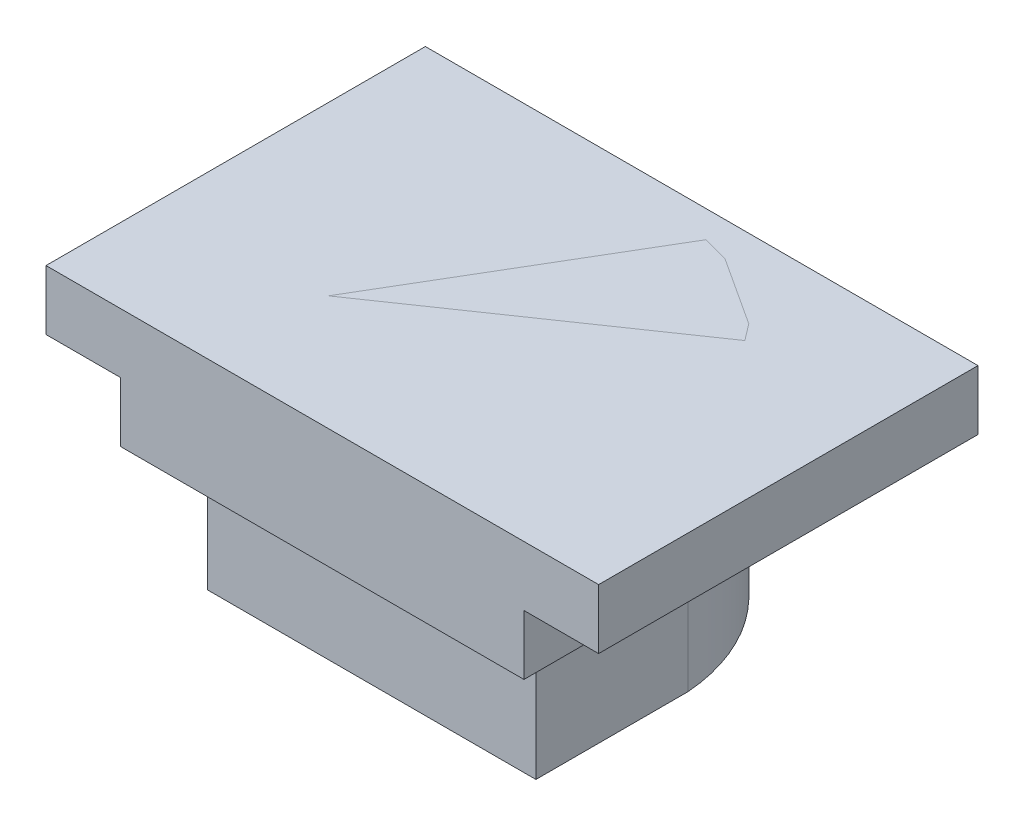
ISO-10303-21;
HEADER;
FILE_DESCRIPTION(('STEP AP214'),'2;1');
FILE_NAME('part.step','',(''),(''),'','','');
FILE_SCHEMA(('AUTOMOTIVE_DESIGN { 1 0 10303 214 1 1 1 1 }'));
ENDSEC;
DATA;
#1=APPLICATION_CONTEXT('core data for automotive mechanical design processes');
#2=APPLICATION_PROTOCOL_DEFINITION('international standard','automotive_design',2000,#1);
#3=PRODUCT_CONTEXT('',#1,'mechanical');
#4=PRODUCT('Part','Part','',(#3));
#5=PRODUCT_RELATED_PRODUCT_CATEGORY('part','',(#4));
#6=PRODUCT_DEFINITION_FORMATION('','',#4);
#7=PRODUCT_DEFINITION_CONTEXT('part definition',#1,'design');
#8=PRODUCT_DEFINITION('design','',#6,#7);
#9=PRODUCT_DEFINITION_SHAPE('','',#8);
#10=(LENGTH_UNIT() NAMED_UNIT(*) SI_UNIT(.MILLI.,.METRE.));
#11=(NAMED_UNIT(*) PLANE_ANGLE_UNIT() SI_UNIT($,.RADIAN.));
#12=(NAMED_UNIT(*) SI_UNIT($,.STERADIAN.) SOLID_ANGLE_UNIT());
#13=UNCERTAINTY_MEASURE_WITH_UNIT(LENGTH_MEASURE(1.E-05),#10,'distance_accuracy_value','');
#14=(GEOMETRIC_REPRESENTATION_CONTEXT(3) GLOBAL_UNCERTAINTY_ASSIGNED_CONTEXT((#13)) GLOBAL_UNIT_ASSIGNED_CONTEXT((#10,
#11,#12)) REPRESENTATION_CONTEXT('',''));
#15=CARTESIAN_POINT('',(0.,0.,0.));
#16=DIRECTION('',(0.,0.,1.));
#17=DIRECTION('',(1.,0.,0.));
#18=AXIS2_PLACEMENT_3D('',#15,#16,#17);
#19=CARTESIAN_POINT('',(-3.0812919081969,-14.6034531628728,-2.56662941493609));
#20=DIRECTION('',(0.,1.,0.));
#21=DIRECTION('',(0.,0.,1.));
#22=AXIS2_PLACEMENT_3D('',#19,#20,#21);
#23=CYLINDRICAL_SURFACE('',#22,2.99041189);
#24=DIRECTION('',(0.,1.,0.));
#25=VECTOR('',#24,1.);
#26=CARTESIAN_POINT('',(-2.5,-14.6034531628728,-5.5));
#27=LINE('',#26,#25);
#28=CARTESIAN_POINT('',(-2.5,-5.,-5.5));
#29=VERTEX_POINT('',#28);
#30=CARTESIAN_POINT('',(-2.5,-1.,-5.5));
#31=VERTEX_POINT('',#30);
#32=EDGE_CURVE('E76',#29,#31,#27,.T.);
#33=ORIENTED_EDGE('',*,*,#32,.T.);
#34=CARTESIAN_POINT('',(-3.0812919081969,-0.999999999999999,-2.56662941493609));
#35=DIRECTION('',(0.,-1.,0.));
#36=DIRECTION('',(0.,0.,-1.));
#37=AXIS2_PLACEMENT_3D('',#34,#35,#36);
#38=CIRCLE('',#37,2.99041189);
#39=CARTESIAN_POINT('',(-0.1,-0.999999999999999,-2.8));
#40=VERTEX_POINT('',#39);
#41=EDGE_CURVE('E70',#31,#40,#38,.T.);
#42=ORIENTED_EDGE('',*,*,#41,.T.);
#43=DIRECTION('',(0.,1.,0.));
#44=VECTOR('',#43,1.);
#45=CARTESIAN_POINT('',(-0.1,-14.6034531628728,-2.8));
#46=LINE('',#45,#44);
#47=CARTESIAN_POINT('',(-0.1,-5.,-2.8));
#48=VERTEX_POINT('',#47);
#49=EDGE_CURVE('E130',#48,#40,#46,.T.);
#50=ORIENTED_EDGE('',*,*,#49,.F.);
#51=CARTESIAN_POINT('',(-3.0812919081969,-5.,-2.56662941493609));
#52=DIRECTION('',(0.,-1.,0.));
#53=DIRECTION('',(0.,0.,-1.));
#54=AXIS2_PLACEMENT_3D('',#51,#52,#53);
#55=CIRCLE('',#54,2.99041189);
#56=EDGE_CURVE('E63',#29,#48,#55,.T.);
#57=ORIENTED_EDGE('',*,*,#56,.F.);
#58=EDGE_LOOP('',(#33,#42,#50,#57));
#59=FACE_BOUND('',#58,.T.);
#60=ADVANCED_FACE('F54',(#59),#23,.T.);
#61=CARTESIAN_POINT('',(-0.1,-14.6034531628728,0.));
#62=DIRECTION('',(1.,0.,0.));
#63=DIRECTION('',(0.,0.,-1.));
#64=AXIS2_PLACEMENT_3D('',#61,#62,#63);
#65=PLANE('',#64);
#66=DIRECTION('',(0.,0.,-1.));
#67=VECTOR('',#66,1.);
#68=CARTESIAN_POINT('',(-0.1,-0.999999999999999,0.));
#69=LINE('',#68,#67);
#70=CARTESIAN_POINT('',(-0.1,-0.999999999999999,-0.249999999999999));
#71=VERTEX_POINT('',#70);
#72=EDGE_CURVE('E132',#71,#40,#69,.T.);
#73=ORIENTED_EDGE('',*,*,#72,.F.);
#74=DIRECTION('',(0.,1.,0.));
#75=VECTOR('',#74,1.);
#76=CARTESIAN_POINT('',(-0.1,-14.6034531628728,-0.249999999999999));
#77=LINE('',#76,#75);
#78=CARTESIAN_POINT('',(-0.1,-5.,-0.249999999999999));
#79=VERTEX_POINT('',#78);
#80=EDGE_CURVE('E142',#79,#71,#77,.T.);
#81=ORIENTED_EDGE('',*,*,#80,.F.);
#82=DIRECTION('',(0.,0.,-1.));
#83=VECTOR('',#82,1.);
#84=CARTESIAN_POINT('',(-0.1,-5.,0.));
#85=LINE('',#84,#83);
#86=EDGE_CURVE('E126',#79,#48,#85,.T.);
#87=ORIENTED_EDGE('',*,*,#86,.T.);
#88=ORIENTED_EDGE('',*,*,#49,.T.);
#89=EDGE_LOOP('',(#73,#81,#87,#88));
#90=FACE_BOUND('',#89,.T.);
#91=ADVANCED_FACE('F159',(#90),#65,.T.);
#92=CARTESIAN_POINT('',(0.,-14.6034531628728,-0.249999999999999));
#93=DIRECTION('',(0.,0.,1.));
#94=DIRECTION('',(1.,0.,0.));
#95=AXIS2_PLACEMENT_3D('',#92,#93,#94);
#96=PLANE('',#95);
#97=DIRECTION('',(1.,0.,0.));
#98=VECTOR('',#97,1.);
#99=CARTESIAN_POINT('',(0.,-0.999999999999999,-0.249999999999999));
#100=LINE('',#99,#98);
#101=CARTESIAN_POINT('',(-5.6,-0.999999999999999,-0.249999999999999));
#102=VERTEX_POINT('',#101);
#103=EDGE_CURVE('E111',#102,#71,#100,.T.);
#104=ORIENTED_EDGE('',*,*,#103,.F.);
#105=DIRECTION('',(0.,1.,0.));
#106=VECTOR('',#105,1.);
#107=CARTESIAN_POINT('',(-5.6,-14.6034531628728,-0.249999999999999));
#108=LINE('',#107,#106);
#109=CARTESIAN_POINT('',(-5.6,-5.,-0.249999999999999));
#110=VERTEX_POINT('',#109);
#111=EDGE_CURVE('E109',#110,#102,#108,.T.);
#112=ORIENTED_EDGE('',*,*,#111,.F.);
#113=DIRECTION('',(1.,0.,0.));
#114=VECTOR('',#113,1.);
#115=CARTESIAN_POINT('',(0.,-5.,-0.249999999999999));
#116=LINE('',#115,#114);
#117=EDGE_CURVE('E143',#110,#79,#116,.T.);
#118=ORIENTED_EDGE('',*,*,#117,.T.);
#119=ORIENTED_EDGE('',*,*,#80,.T.);
#120=EDGE_LOOP('',(#104,#112,#118,#119));
#121=FACE_BOUND('',#120,.T.);
#122=ADVANCED_FACE('F154',(#121),#96,.T.);
#123=CARTESIAN_POINT('',(-5.6,-14.6034531628728,0.));
#124=DIRECTION('',(-1.,0.,0.));
#125=DIRECTION('',(0.,0.,1.));
#126=AXIS2_PLACEMENT_3D('',#123,#124,#125);
#127=PLANE('',#126);
#128=DIRECTION('',(0.,0.,1.));
#129=VECTOR('',#128,1.);
#130=CARTESIAN_POINT('',(-5.6,-0.999999999999999,0.));
#131=LINE('',#130,#129);
#132=CARTESIAN_POINT('',(-5.6,-0.999999999999999,-5.5));
#133=VERTEX_POINT('',#132);
#134=EDGE_CURVE('E101',#133,#102,#131,.T.);
#135=ORIENTED_EDGE('',*,*,#134,.F.);
#136=DIRECTION('',(0.,1.,0.));
#137=VECTOR('',#136,1.);
#138=CARTESIAN_POINT('',(-5.6,-14.6034531628728,-5.5));
#139=LINE('',#138,#137);
#140=CARTESIAN_POINT('',(-5.6,-5.,-5.5));
#141=VERTEX_POINT('',#140);
#142=EDGE_CURVE('E107',#141,#133,#139,.T.);
#143=ORIENTED_EDGE('',*,*,#142,.F.);
#144=DIRECTION('',(0.,0.,1.));
#145=VECTOR('',#144,1.);
#146=CARTESIAN_POINT('',(-5.6,-5.,0.));
#147=LINE('',#146,#145);
#148=EDGE_CURVE('E122',#141,#110,#147,.T.);
#149=ORIENTED_EDGE('',*,*,#148,.T.);
#150=ORIENTED_EDGE('',*,*,#111,.T.);
#151=EDGE_LOOP('',(#135,#143,#149,#150));
#152=FACE_BOUND('',#151,.T.);
#153=ADVANCED_FACE('F106',(#152),#127,.T.);
#154=CARTESIAN_POINT('',(0.,-14.6034531628728,-5.5));
#155=DIRECTION('',(0.,0.,1.));
#156=DIRECTION('',(1.,0.,0.));
#157=AXIS2_PLACEMENT_3D('',#154,#155,#156);
#158=PLANE('',#157);
#159=ORIENTED_EDGE('',*,*,#142,.T.);
#160=DIRECTION('',(1.,0.,0.));
#161=VECTOR('',#160,1.);
#162=CARTESIAN_POINT('',(0.,-0.999999999999999,-5.5));
#163=LINE('',#162,#161);
#164=EDGE_CURVE('E12',#133,#31,#163,.T.);
#165=ORIENTED_EDGE('',*,*,#164,.T.);
#166=ORIENTED_EDGE('',*,*,#32,.F.);
#167=DIRECTION('',(1.,0.,0.));
#168=VECTOR('',#167,1.);
#169=CARTESIAN_POINT('',(0.,-5.,-5.5));
#170=LINE('',#169,#168);
#171=EDGE_CURVE('E115',#141,#29,#170,.T.);
#172=ORIENTED_EDGE('',*,*,#171,.F.);
#173=EDGE_LOOP('',(#159,#165,#166,#172));
#174=FACE_BOUND('',#173,.T.);
#175=ADVANCED_FACE('F113',(#174),#158,.F.);
#176=CARTESIAN_POINT('',(-3.01188081954191,-5.,-2.61735800729014));
#177=DIRECTION('',(0.,-1.,0.));
#178=DIRECTION('',(0.,0.,-1.));
#179=AXIS2_PLACEMENT_3D('',#176,#177,#178);
#180=PLANE('',#179);
#181=ORIENTED_EDGE('',*,*,#171,.T.);
#182=ORIENTED_EDGE('',*,*,#56,.T.);
#183=ORIENTED_EDGE('',*,*,#86,.F.);
#184=ORIENTED_EDGE('',*,*,#117,.F.);
#185=ORIENTED_EDGE('',*,*,#148,.F.);
#186=EDGE_LOOP('',(#181,#182,#183,#184,#185));
#187=FACE_BOUND('',#186,.T.);
#188=ADVANCED_FACE('F56',(#187),#180,.T.);
#189=CARTESIAN_POINT('',(-3.01188081954191,-1.,-2.61735800729014));
#190=DIRECTION('',(0.,-1.,0.));
#191=DIRECTION('',(0.,0.,-1.));
#192=AXIS2_PLACEMENT_3D('',#189,#190,#191);
#193=PLANE('',#192);
#194=ORIENTED_EDGE('',*,*,#164,.F.);
#195=ORIENTED_EDGE('',*,*,#134,.T.);
#196=ORIENTED_EDGE('',*,*,#103,.T.);
#197=ORIENTED_EDGE('',*,*,#72,.T.);
#198=ORIENTED_EDGE('',*,*,#41,.F.);
#199=EDGE_LOOP('',(#194,#195,#196,#197,#198));
#200=FACE_BOUND('',#199,.T.);
#201=ADVANCED_FACE('F100',(#200),#193,.F.);
#202=CLOSED_SHELL('',(#60,#91,#122,#153,#175,#188,#201));
#203=MANIFOLD_SOLID_BREP('B2',#202);
#204=CARTESIAN_POINT('',(0.,-2.,0.));
#205=DIRECTION('',(0.,-1.,0.));
#206=DIRECTION('',(0.,0.,-1.));
#207=AXIS2_PLACEMENT_3D('',#204,#205,#206);
#208=PLANE('',#207);
#209=DIRECTION('',(1.,0.,0.));
#210=VECTOR('',#209,1.);
#211=CARTESIAN_POINT('',(-7.65,-2.,-5.95));
#212=LINE('',#211,#210);
#213=CARTESIAN_POINT('',(-7.65,-2.,-5.95));
#214=VERTEX_POINT('',#213);
#215=CARTESIAN_POINT('',(-6.4,-2.,-5.95));
#216=VERTEX_POINT('',#215);
#217=EDGE_CURVE('E335',#214,#216,#212,.T.);
#218=ORIENTED_EDGE('',*,*,#217,.T.);
#219=DIRECTION('',(0.,0.,1.));
#220=VECTOR('',#219,1.);
#221=CARTESIAN_POINT('',(-6.4,-2.,0.));
#222=LINE('',#221,#220);
#223=CARTESIAN_POINT('',(-6.4,-2.,0.4));
#224=VERTEX_POINT('',#223);
#225=EDGE_CURVE('E52',#216,#224,#222,.T.);
#226=ORIENTED_EDGE('',*,*,#225,.T.);
#227=DIRECTION('',(-1.,0.,0.));
#228=VECTOR('',#227,1.);
#229=CARTESIAN_POINT('',(-7.65,-2.,0.399999999999999));
#230=LINE('',#229,#228);
#231=CARTESIAN_POINT('',(-7.65,-2.,0.399999999999999));
#232=VERTEX_POINT('',#231);
#233=EDGE_CURVE('E339',#224,#232,#230,.T.);
#234=ORIENTED_EDGE('',*,*,#233,.T.);
#235=DIRECTION('',(0.,0.,-1.));
#236=VECTOR('',#235,1.);
#237=CARTESIAN_POINT('',(-7.65,-2.,0.399999999999999));
#238=LINE('',#237,#236);
#239=EDGE_CURVE('E330',#232,#214,#238,.T.);
#240=ORIENTED_EDGE('',*,*,#239,.T.);
#241=EDGE_LOOP('',(#218,#226,#234,#240));
#242=FACE_BOUND('',#241,.T.);
#243=ADVANCED_FACE('F220',(#242),#208,.T.);
#244=DIRECTION('',(0.,0.,-1.));
#245=VECTOR('',#244,1.);
#246=CARTESIAN_POINT('',(0.35,-2.,0.));
#247=LINE('',#246,#245);
#248=CARTESIAN_POINT('',(0.35,-2.,0.399999999999999));
#249=VERTEX_POINT('',#248);
#250=CARTESIAN_POINT('',(0.35,-2.,-2.75));
#251=VERTEX_POINT('',#250);
#252=EDGE_CURVE('E235',#249,#251,#247,.T.);
#253=ORIENTED_EDGE('',*,*,#252,.T.);
#254=CARTESIAN_POINT('',(-3.01188081954191,-2.,-2.61735800729014));
#255=DIRECTION('',(0.,-1.,0.));
#256=DIRECTION('',(0.,0.,-1.));
#257=AXIS2_PLACEMENT_3D('',#254,#255,#256);
#258=CIRCLE('',#257,3.36449647689425);
#259=CARTESIAN_POINT('',(-2.55,-2.,-5.95));
#260=VERTEX_POINT('',#259);
#261=EDGE_CURVE('E228',#251,#260,#258,.F.);
#262=ORIENTED_EDGE('',*,*,#261,.T.);
#263=CARTESIAN_POINT('',(1.6,-2.,-5.95));
#264=VERTEX_POINT('',#263);
#265=EDGE_CURVE('E333',#260,#264,#212,.T.);
#266=ORIENTED_EDGE('',*,*,#265,.T.);
#267=DIRECTION('',(0.,0.,1.));
#268=VECTOR('',#267,1.);
#269=CARTESIAN_POINT('',(1.6,-2.,0.399999999999999));
#270=LINE('',#269,#268);
#271=CARTESIAN_POINT('',(1.6,-2.,0.399999999999999));
#272=VERTEX_POINT('',#271);
#273=EDGE_CURVE('E337',#264,#272,#270,.T.);
#274=ORIENTED_EDGE('',*,*,#273,.T.);
#275=EDGE_CURVE('E240',#272,#249,#230,.T.);
#276=ORIENTED_EDGE('',*,*,#275,.T.);
#277=EDGE_LOOP('',(#253,#262,#266,#274,#276));
#278=FACE_BOUND('',#277,.T.);
#279=ADVANCED_FACE('F358',(#278),#208,.T.);
#280=CARTESIAN_POINT('',(-6.4,-1.,-5.95));
#281=DIRECTION('',(0.,0.,1.));
#282=DIRECTION('',(1.,0.,0.));
#283=AXIS2_PLACEMENT_3D('',#280,#281,#282);
#284=PLANE('',#283);
#285=DIRECTION('',(1.,0.,0.));
#286=VECTOR('',#285,1.);
#287=CARTESIAN_POINT('',(-7.65,-1.,-5.95));
#288=LINE('',#287,#286);
#289=CARTESIAN_POINT('',(-7.65,-1.,-5.95));
#290=VERTEX_POINT('',#289);
#291=CARTESIAN_POINT('',(1.6,-1.,-5.95));
#292=VERTEX_POINT('',#291);
#293=EDGE_CURVE('E315',#290,#292,#288,.T.);
#294=ORIENTED_EDGE('',*,*,#293,.T.);
#295=DIRECTION('',(0.,1.,0.));
#296=VECTOR('',#295,1.);
#297=CARTESIAN_POINT('',(1.6,-2.,-5.95));
#298=LINE('',#297,#296);
#299=EDGE_CURVE('E351',#264,#292,#298,.T.);
#300=ORIENTED_EDGE('',*,*,#299,.F.);
#301=ORIENTED_EDGE('',*,*,#265,.F.);
#302=DIRECTION('',(0.,1.,0.));
#303=VECTOR('',#302,1.);
#304=CARTESIAN_POINT('',(-2.55,-15.2674160368465,-5.95));
#305=LINE('',#304,#303);
#306=CARTESIAN_POINT('',(-2.55,-3.,-5.95));
#307=VERTEX_POINT('',#306);
#308=EDGE_CURVE('E325',#307,#260,#305,.T.);
#309=ORIENTED_EDGE('',*,*,#308,.F.);
#310=DIRECTION('',(1.,0.,0.));
#311=VECTOR('',#310,1.);
#312=CARTESIAN_POINT('',(-6.4,-3.,-5.95));
#313=LINE('',#312,#311);
#314=CARTESIAN_POINT('',(-6.4,-3.,-5.95));
#315=VERTEX_POINT('',#314);
#316=EDGE_CURVE('E317',#315,#307,#313,.T.);
#317=ORIENTED_EDGE('',*,*,#316,.F.);
#318=DIRECTION('',(0.,1.,0.));
#319=VECTOR('',#318,1.);
#320=CARTESIAN_POINT('',(-6.4,-15.2674160368465,-5.95));
#321=LINE('',#320,#319);
#322=EDGE_CURVE('E322',#315,#216,#321,.T.);
#323=ORIENTED_EDGE('',*,*,#322,.T.);
#324=ORIENTED_EDGE('',*,*,#217,.F.);
#325=DIRECTION('',(0.,1.,0.));
#326=VECTOR('',#325,1.);
#327=CARTESIAN_POINT('',(-7.65,-2.,-5.95));
#328=LINE('',#327,#326);
#329=EDGE_CURVE('E354',#214,#290,#328,.T.);
#330=ORIENTED_EDGE('',*,*,#329,.T.);
#331=EDGE_LOOP('',(#294,#300,#301,#309,#317,#323,#324,#330));
#332=FACE_BOUND('',#331,.T.);
#333=ADVANCED_FACE('F222',(#332),#284,.F.);
#334=CARTESIAN_POINT('',(-6.4,-1.,0.4));
#335=DIRECTION('',(0.,0.,-1.));
#336=DIRECTION('',(-1.,0.,0.));
#337=AXIS2_PLACEMENT_3D('',#334,#335,#336);
#338=PLANE('',#337);
#339=DIRECTION('',(-1.,0.,0.));
#340=VECTOR('',#339,1.);
#341=CARTESIAN_POINT('',(-7.65,-1.,0.399999999999999));
#342=LINE('',#341,#340);
#343=CARTESIAN_POINT('',(1.6,-1.,0.399999999999999));
#344=VERTEX_POINT('',#343);
#345=CARTESIAN_POINT('',(-7.65,-1.,0.399999999999999));
#346=VERTEX_POINT('',#345);
#347=EDGE_CURVE('E334',#344,#346,#342,.T.);
#348=ORIENTED_EDGE('',*,*,#347,.T.);
#349=DIRECTION('',(0.,1.,0.));
#350=VECTOR('',#349,1.);
#351=CARTESIAN_POINT('',(-7.65,-2.,0.399999999999999));
#352=LINE('',#351,#350);
#353=EDGE_CURVE('E340',#232,#346,#352,.T.);
#354=ORIENTED_EDGE('',*,*,#353,.F.);
#355=ORIENTED_EDGE('',*,*,#233,.F.);
#356=DIRECTION('',(0.,1.,0.));
#357=VECTOR('',#356,1.);
#358=CARTESIAN_POINT('',(-6.4,-15.2674160368465,0.4));
#359=LINE('',#358,#357);
#360=CARTESIAN_POINT('',(-6.4,-3.,0.4));
#361=VERTEX_POINT('',#360);
#362=EDGE_CURVE('E302',#361,#224,#359,.T.);
#363=ORIENTED_EDGE('',*,*,#362,.F.);
#364=DIRECTION('',(-1.,0.,0.));
#365=VECTOR('',#364,1.);
#366=CARTESIAN_POINT('',(-6.4,-3.,0.4));
#367=LINE('',#366,#365);
#368=CARTESIAN_POINT('',(0.35,-3.,0.4));
#369=VERTEX_POINT('',#368);
#370=EDGE_CURVE('E296',#369,#361,#367,.T.);
#371=ORIENTED_EDGE('',*,*,#370,.F.);
#372=DIRECTION('',(0.,1.,0.));
#373=VECTOR('',#372,1.);
#374=CARTESIAN_POINT('',(0.35,-15.2674160368465,0.4));
#375=LINE('',#374,#373);
#376=EDGE_CURVE('E288',#369,#249,#375,.T.);
#377=ORIENTED_EDGE('',*,*,#376,.T.);
#378=ORIENTED_EDGE('',*,*,#275,.F.);
#379=DIRECTION('',(0.,1.,0.));
#380=VECTOR('',#379,1.);
#381=CARTESIAN_POINT('',(1.6,-2.,0.399999999999999));
#382=LINE('',#381,#380);
#383=EDGE_CURVE('E348',#272,#344,#382,.T.);
#384=ORIENTED_EDGE('',*,*,#383,.T.);
#385=EDGE_LOOP('',(#348,#354,#355,#363,#371,#377,#378,#384));
#386=FACE_BOUND('',#385,.T.);
#387=ADVANCED_FACE('F300',(#386),#338,.F.);
#388=CARTESIAN_POINT('',(0.,-1.,0.));
#389=DIRECTION('',(0.,-1.,0.));
#390=DIRECTION('',(0.,0.,-1.));
#391=AXIS2_PLACEMENT_3D('',#388,#389,#390);
#392=PLANE('',#391);
#393=DIRECTION('',(0.,0.,-1.));
#394=VECTOR('',#393,1.);
#395=CARTESIAN_POINT('',(-7.65,-1.,0.399999999999999));
#396=LINE('',#395,#394);
#397=EDGE_CURVE('E312',#346,#290,#396,.T.);
#398=ORIENTED_EDGE('',*,*,#397,.F.);
#399=ORIENTED_EDGE('',*,*,#347,.F.);
#400=DIRECTION('',(0.,0.,1.));
#401=VECTOR('',#400,1.);
#402=CARTESIAN_POINT('',(1.6,-1.,0.399999999999999));
#403=LINE('',#402,#401);
#404=EDGE_CURVE('E343',#292,#344,#403,.T.);
#405=ORIENTED_EDGE('',*,*,#404,.F.);
#406=ORIENTED_EDGE('',*,*,#293,.F.);
#407=EDGE_LOOP('',(#398,#399,#405,#406));
#408=FACE_BOUND('',#407,.T.);
#409=ADVANCED_FACE('F384',(#408),#392,.F.);
#410=CARTESIAN_POINT('',(-7.65,-2.,0.399999999999999));
#411=DIRECTION('',(1.,0.,0.));
#412=DIRECTION('',(0.,0.,-1.));
#413=AXIS2_PLACEMENT_3D('',#410,#411,#412);
#414=PLANE('',#413);
#415=ORIENTED_EDGE('',*,*,#397,.T.);
#416=ORIENTED_EDGE('',*,*,#329,.F.);
#417=ORIENTED_EDGE('',*,*,#239,.F.);
#418=ORIENTED_EDGE('',*,*,#353,.T.);
#419=EDGE_LOOP('',(#415,#416,#417,#418));
#420=FACE_BOUND('',#419,.T.);
#421=ADVANCED_FACE('F387',(#420),#414,.F.);
#422=CARTESIAN_POINT('',(1.6,-2.,0.399999999999999));
#423=DIRECTION('',(-1.,0.,0.));
#424=DIRECTION('',(0.,0.,1.));
#425=AXIS2_PLACEMENT_3D('',#422,#423,#424);
#426=PLANE('',#425);
#427=ORIENTED_EDGE('',*,*,#404,.T.);
#428=ORIENTED_EDGE('',*,*,#383,.F.);
#429=ORIENTED_EDGE('',*,*,#273,.F.);
#430=ORIENTED_EDGE('',*,*,#299,.T.);
#431=EDGE_LOOP('',(#427,#428,#429,#430));
#432=FACE_BOUND('',#431,.T.);
#433=ADVANCED_FACE('F373',(#432),#426,.F.);
#434=CARTESIAN_POINT('',(-6.4,-15.2674160368465,0.4));
#435=DIRECTION('',(1.,0.,0.));
#436=DIRECTION('',(0.,0.,-1.));
#437=AXIS2_PLACEMENT_3D('',#434,#435,#436);
#438=PLANE('',#437);
#439=ORIENTED_EDGE('',*,*,#225,.F.);
#440=ORIENTED_EDGE('',*,*,#322,.F.);
#441=DIRECTION('',(0.,0.,-1.));
#442=VECTOR('',#441,1.);
#443=CARTESIAN_POINT('',(-6.4,-3.,0.4));
#444=LINE('',#443,#442);
#445=EDGE_CURVE('E306',#361,#315,#444,.T.);
#446=ORIENTED_EDGE('',*,*,#445,.F.);
#447=ORIENTED_EDGE('',*,*,#362,.T.);
#448=EDGE_LOOP('',(#439,#440,#446,#447));
#449=FACE_BOUND('',#448,.T.);
#450=ADVANCED_FACE('F366',(#449),#438,.F.);
#451=CARTESIAN_POINT('',(-3.01188081954191,-15.2674160368465,-2.61735800729014));
#452=DIRECTION('',(0.,1.,0.));
#453=DIRECTION('',(0.,0.,1.));
#454=AXIS2_PLACEMENT_3D('',#451,#452,#453);
#455=CYLINDRICAL_SURFACE('',#454,3.36449647689425);
#456=ORIENTED_EDGE('',*,*,#261,.F.);
#457=DIRECTION('',(0.,1.,0.));
#458=VECTOR('',#457,1.);
#459=CARTESIAN_POINT('',(0.35,-15.2674160368465,-2.75));
#460=LINE('',#459,#458);
#461=CARTESIAN_POINT('',(0.35,-3.,-2.75));
#462=VERTEX_POINT('',#461);
#463=EDGE_CURVE('E297',#462,#251,#460,.T.);
#464=ORIENTED_EDGE('',*,*,#463,.F.);
#465=CARTESIAN_POINT('',(-3.01188081954191,-3.,-2.61735800729014));
#466=DIRECTION('',(0.,-1.,0.));
#467=DIRECTION('',(0.,0.,-1.));
#468=AXIS2_PLACEMENT_3D('',#465,#466,#467);
#469=CIRCLE('',#468,3.36449647689425);
#470=EDGE_CURVE('E311',#307,#462,#469,.T.);
#471=ORIENTED_EDGE('',*,*,#470,.F.);
#472=ORIENTED_EDGE('',*,*,#308,.T.);
#473=EDGE_LOOP('',(#456,#464,#471,#472));
#474=FACE_BOUND('',#473,.T.);
#475=ADVANCED_FACE('F364',(#474),#455,.T.);
#476=CARTESIAN_POINT('',(0.35,-15.2674160368465,0.4));
#477=DIRECTION('',(-1.,0.,0.));
#478=DIRECTION('',(0.,0.,1.));
#479=AXIS2_PLACEMENT_3D('',#476,#477,#478);
#480=PLANE('',#479);
#481=ORIENTED_EDGE('',*,*,#252,.F.);
#482=ORIENTED_EDGE('',*,*,#376,.F.);
#483=DIRECTION('',(0.,0.,1.));
#484=VECTOR('',#483,1.);
#485=CARTESIAN_POINT('',(0.35,-3.,0.4));
#486=LINE('',#485,#484);
#487=EDGE_CURVE('E293',#462,#369,#486,.T.);
#488=ORIENTED_EDGE('',*,*,#487,.F.);
#489=ORIENTED_EDGE('',*,*,#463,.T.);
#490=EDGE_LOOP('',(#481,#482,#488,#489));
#491=FACE_BOUND('',#490,.T.);
#492=ADVANCED_FACE('F290',(#491),#480,.F.);
#493=CARTESIAN_POINT('',(-3.01188081954191,-3.,-2.61735800729014));
#494=DIRECTION('',(0.,-1.,0.));
#495=DIRECTION('',(0.,0.,-1.));
#496=AXIS2_PLACEMENT_3D('',#493,#494,#495);
#497=PLANE('',#496);
#498=ORIENTED_EDGE('',*,*,#370,.T.);
#499=ORIENTED_EDGE('',*,*,#445,.T.);
#500=ORIENTED_EDGE('',*,*,#316,.T.);
#501=ORIENTED_EDGE('',*,*,#470,.T.);
#502=ORIENTED_EDGE('',*,*,#487,.T.);
#503=EDGE_LOOP('',(#498,#499,#500,#501,#502));
#504=FACE_BOUND('',#503,.T.);
#505=ADVANCED_FACE('F309',(#504),#497,.T.);
#506=CLOSED_SHELL('',(#243,#279,#333,#387,#409,#421,#433,#450,#475,#492,#505));
#507=MANIFOLD_SOLID_BREP('B6',#506);
#508=ADVANCED_BREP_SHAPE_REPRESENTATION('',(#18,#203,#507),#14);
#509=SHAPE_DEFINITION_REPRESENTATION(#9,#508);
ENDSEC;
END-ISO-10303-21;
